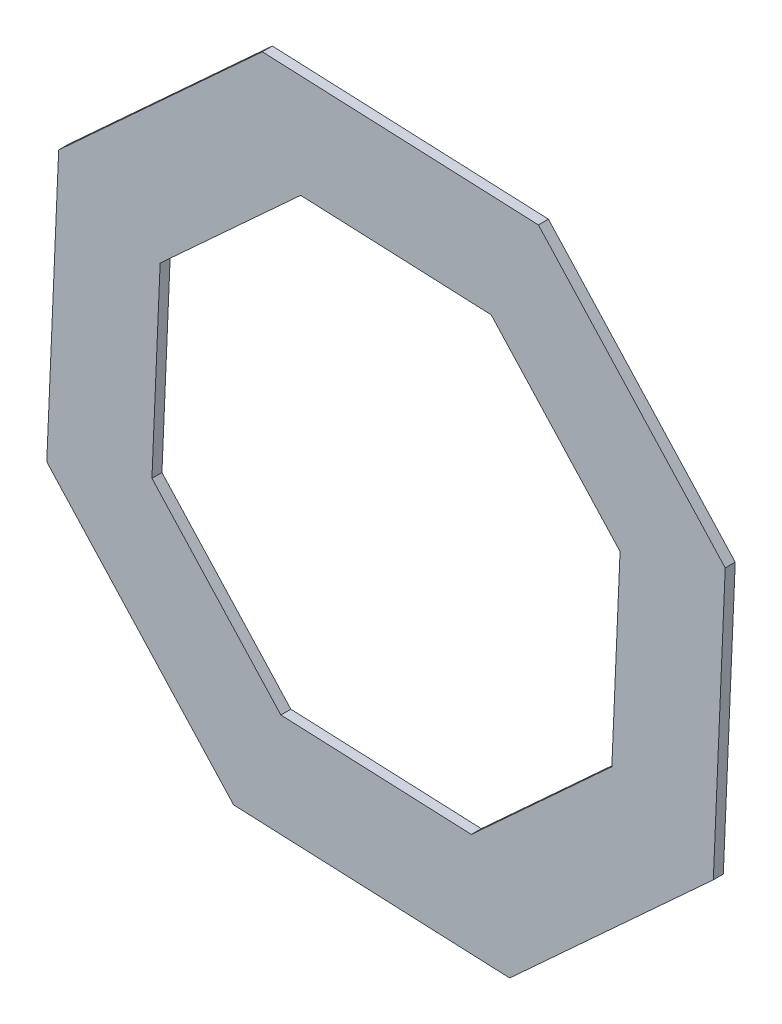
ISO-10303-21;
HEADER;
FILE_DESCRIPTION(('STEP AP214'),'2;1');
FILE_NAME('part.step','',(''),(''),'','','');
FILE_SCHEMA(('AUTOMOTIVE_DESIGN { 1 0 10303 214 1 1 1 1 }'));
ENDSEC;
DATA;
#1=APPLICATION_CONTEXT('core data for automotive mechanical design processes');
#2=APPLICATION_PROTOCOL_DEFINITION('international standard','automotive_design',2000,#1);
#3=PRODUCT_CONTEXT('',#1,'mechanical');
#4=PRODUCT('Part','Part','',(#3));
#5=PRODUCT_RELATED_PRODUCT_CATEGORY('part','',(#4));
#6=PRODUCT_DEFINITION_FORMATION('','',#4);
#7=PRODUCT_DEFINITION_CONTEXT('part definition',#1,'design');
#8=PRODUCT_DEFINITION('design','',#6,#7);
#9=PRODUCT_DEFINITION_SHAPE('','',#8);
#10=(LENGTH_UNIT() NAMED_UNIT(*) SI_UNIT(.MILLI.,.METRE.));
#11=(NAMED_UNIT(*) PLANE_ANGLE_UNIT() SI_UNIT($,.RADIAN.));
#12=(NAMED_UNIT(*) SI_UNIT($,.STERADIAN.) SOLID_ANGLE_UNIT());
#13=UNCERTAINTY_MEASURE_WITH_UNIT(LENGTH_MEASURE(1.E-05),#10,'distance_accuracy_value','');
#14=(GEOMETRIC_REPRESENTATION_CONTEXT(3) GLOBAL_UNCERTAINTY_ASSIGNED_CONTEXT((#13)) GLOBAL_UNIT_ASSIGNED_CONTEXT((#10,
#11,#12)) REPRESENTATION_CONTEXT('',''));
#15=CARTESIAN_POINT('',(0.,0.,0.));
#16=DIRECTION('',(0.,0.,1.));
#17=DIRECTION('',(1.,0.,0.));
#18=AXIS2_PLACEMENT_3D('',#15,#16,#17);
#19=CARTESIAN_POINT('',(45.692015403292,98.1222119650972,3.));
#20=DIRECTION('',(-0.0430913393774792,-0.999071136841944,0.));
#21=DIRECTION('',(0.999071136841944,-0.0430913393774792,0.));
#22=AXIS2_PLACEMENT_3D('',#19,#20,#21);
#23=PLANE('',#22);
#24=DIRECTION('',(-0.999071136841944,0.0430913393774792,0.));
#25=VECTOR('',#24,1.);
#26=CARTESIAN_POINT('',(45.692015403292,98.1222119650972,0.));
#27=LINE('',#26,#25);
#28=CARTESIAN_POINT('',(45.692015403292,98.1222119650972,0.));
#29=VERTEX_POINT('',#28);
#30=CARTESIAN_POINT('',(-37.0737475277961,101.692015403292,0.));
#31=VERTEX_POINT('',#30);
#32=EDGE_CURVE('E202',#29,#31,#27,.T.);
#33=ORIENTED_EDGE('',*,*,#32,.T.);
#34=DIRECTION('',(0.,0.,-1.));
#35=VECTOR('',#34,1.);
#36=CARTESIAN_POINT('',(-37.0737475277961,101.692015403292,3.));
#37=LINE('',#36,#35);
#38=CARTESIAN_POINT('',(-37.0737475277961,101.692015403292,3.));
#39=VERTEX_POINT('',#38);
#40=EDGE_CURVE('E11',#39,#31,#37,.T.);
#41=ORIENTED_EDGE('',*,*,#40,.F.);
#42=DIRECTION('',(-0.999071136841944,0.0430913393774792,0.));
#43=VECTOR('',#42,1.);
#44=CARTESIAN_POINT('',(45.692015403292,98.1222119650972,3.));
#45=LINE('',#44,#43);
#46=CARTESIAN_POINT('',(45.692015403292,98.1222119650972,3.));
#47=VERTEX_POINT('',#46);
#48=EDGE_CURVE('E214',#47,#39,#45,.T.);
#49=ORIENTED_EDGE('',*,*,#48,.F.);
#50=DIRECTION('',(0.,0.,-1.));
#51=VECTOR('',#50,1.);
#52=CARTESIAN_POINT('',(45.692015403292,98.1222119650972,3.));
#53=LINE('',#52,#51);
#54=EDGE_CURVE('E232',#47,#29,#53,.T.);
#55=ORIENTED_EDGE('',*,*,#54,.T.);
#56=EDGE_LOOP('',(#33,#41,#49,#55));
#57=FACE_BOUND('',#56,.T.);
#58=ADVANCED_FACE('F33',(#57),#23,.F.);
#59=CARTESIAN_POINT('',(-37.0737475277961,101.692015403292,3.));
#60=DIRECTION('',(0.675979797464465,-0.736920154032918,0.));
#61=DIRECTION('',(0.736920154032918,0.675979797464465,0.));
#62=AXIS2_PLACEMENT_3D('',#59,#60,#61);
#63=PLANE('',#62);
#64=DIRECTION('',(-0.736920154032918,-0.675979797464465,0.));
#65=VECTOR('',#64,1.);
#66=CARTESIAN_POINT('',(-37.0737475277961,101.692015403292,0.));
#67=LINE('',#66,#65);
#68=CARTESIAN_POINT('',(-98.1222119650972,45.692015403292,0.));
#69=VERTEX_POINT('',#68);
#70=EDGE_CURVE('E235',#31,#69,#67,.T.);
#71=ORIENTED_EDGE('',*,*,#70,.T.);
#72=DIRECTION('',(0.,0.,-1.));
#73=VECTOR('',#72,1.);
#74=CARTESIAN_POINT('',(-98.1222119650972,45.692015403292,3.));
#75=LINE('',#74,#73);
#76=CARTESIAN_POINT('',(-98.1222119650972,45.692015403292,3.));
#77=VERTEX_POINT('',#76);
#78=EDGE_CURVE('E40',#77,#69,#75,.T.);
#79=ORIENTED_EDGE('',*,*,#78,.F.);
#80=DIRECTION('',(-0.736920154032918,-0.675979797464465,0.));
#81=VECTOR('',#80,1.);
#82=CARTESIAN_POINT('',(-37.0737475277961,101.692015403292,3.));
#83=LINE('',#82,#81);
#84=EDGE_CURVE('E217',#39,#77,#83,.T.);
#85=ORIENTED_EDGE('',*,*,#84,.F.);
#86=ORIENTED_EDGE('',*,*,#40,.T.);
#87=EDGE_LOOP('',(#71,#79,#85,#86));
#88=FACE_BOUND('',#87,.T.);
#89=ADVANCED_FACE('F290',(#88),#63,.F.);
#90=CARTESIAN_POINT('',(-98.1222119650972,45.692015403292,3.));
#91=DIRECTION('',(0.999071136841944,-0.0430913393774798,0.));
#92=DIRECTION('',(0.0430913393774798,0.999071136841944,0.));
#93=AXIS2_PLACEMENT_3D('',#90,#91,#92);
#94=PLANE('',#93);
#95=DIRECTION('',(-0.0430913393774798,-0.999071136841944,0.));
#96=VECTOR('',#95,1.);
#97=CARTESIAN_POINT('',(-98.1222119650972,45.692015403292,0.));
#98=LINE('',#97,#96);
#99=CARTESIAN_POINT('',(-101.692015403292,-37.0737475277961,0.));
#100=VERTEX_POINT('',#99);
#101=EDGE_CURVE('E237',#69,#100,#98,.T.);
#102=ORIENTED_EDGE('',*,*,#101,.T.);
#103=DIRECTION('',(0.,0.,-1.));
#104=VECTOR('',#103,1.);
#105=CARTESIAN_POINT('',(-101.692015403292,-37.0737475277961,3.));
#106=LINE('',#105,#104);
#107=CARTESIAN_POINT('',(-101.692015403292,-37.0737475277961,3.));
#108=VERTEX_POINT('',#107);
#109=EDGE_CURVE('E262',#108,#100,#106,.T.);
#110=ORIENTED_EDGE('',*,*,#109,.F.);
#111=DIRECTION('',(-0.0430913393774798,-0.999071136841944,0.));
#112=VECTOR('',#111,1.);
#113=CARTESIAN_POINT('',(-98.1222119650972,45.692015403292,3.));
#114=LINE('',#113,#112);
#115=EDGE_CURVE('E220',#77,#108,#114,.T.);
#116=ORIENTED_EDGE('',*,*,#115,.F.);
#117=ORIENTED_EDGE('',*,*,#78,.T.);
#118=EDGE_LOOP('',(#102,#110,#116,#117));
#119=FACE_BOUND('',#118,.T.);
#120=ADVANCED_FACE('F269',(#119),#94,.F.);
#121=CARTESIAN_POINT('',(-101.692015403292,-37.0737475277961,3.));
#122=DIRECTION('',(0.736920154032918,0.675979797464465,0.));
#123=DIRECTION('',(-0.675979797464465,0.736920154032919,0.));
#124=AXIS2_PLACEMENT_3D('',#121,#122,#123);
#125=PLANE('',#124);
#126=DIRECTION('',(0.675979797464465,-0.736920154032918,0.));
#127=VECTOR('',#126,1.);
#128=CARTESIAN_POINT('',(-101.692015403292,-37.0737475277961,0.));
#129=LINE('',#128,#127);
#130=CARTESIAN_POINT('',(-45.692015403292,-98.1222119650972,0.));
#131=VERTEX_POINT('',#130);
#132=EDGE_CURVE('E239',#100,#131,#129,.T.);
#133=ORIENTED_EDGE('',*,*,#132,.T.);
#134=DIRECTION('',(0.,0.,-1.));
#135=VECTOR('',#134,1.);
#136=CARTESIAN_POINT('',(-45.692015403292,-98.1222119650972,3.));
#137=LINE('',#136,#135);
#138=CARTESIAN_POINT('',(-45.692015403292,-98.1222119650972,3.));
#139=VERTEX_POINT('',#138);
#140=EDGE_CURVE('E259',#139,#131,#137,.T.);
#141=ORIENTED_EDGE('',*,*,#140,.F.);
#142=DIRECTION('',(0.675979797464465,-0.736920154032918,0.));
#143=VECTOR('',#142,1.);
#144=CARTESIAN_POINT('',(-101.692015403292,-37.0737475277961,3.));
#145=LINE('',#144,#143);
#146=EDGE_CURVE('E222',#108,#139,#145,.T.);
#147=ORIENTED_EDGE('',*,*,#146,.F.);
#148=ORIENTED_EDGE('',*,*,#109,.T.);
#149=EDGE_LOOP('',(#133,#141,#147,#148));
#150=FACE_BOUND('',#149,.T.);
#151=ADVANCED_FACE('F280',(#150),#125,.F.);
#152=CARTESIAN_POINT('',(-45.692015403292,-98.1222119650972,3.));
#153=DIRECTION('',(0.0430913393774795,0.999071136841944,0.));
#154=DIRECTION('',(-0.999071136841944,0.0430913393774795,0.));
#155=AXIS2_PLACEMENT_3D('',#152,#153,#154);
#156=PLANE('',#155);
#157=DIRECTION('',(0.999071136841944,-0.0430913393774795,0.));
#158=VECTOR('',#157,1.);
#159=CARTESIAN_POINT('',(-45.692015403292,-98.1222119650972,0.));
#160=LINE('',#159,#158);
#161=CARTESIAN_POINT('',(37.0737475277961,-101.692015403292,0.));
#162=VERTEX_POINT('',#161);
#163=EDGE_CURVE('E241',#131,#162,#160,.T.);
#164=ORIENTED_EDGE('',*,*,#163,.T.);
#165=DIRECTION('',(0.,0.,-1.));
#166=VECTOR('',#165,1.);
#167=CARTESIAN_POINT('',(37.0737475277961,-101.692015403292,3.));
#168=LINE('',#167,#166);
#169=CARTESIAN_POINT('',(37.0737475277961,-101.692015403292,3.));
#170=VERTEX_POINT('',#169);
#171=EDGE_CURVE('E256',#170,#162,#168,.T.);
#172=ORIENTED_EDGE('',*,*,#171,.F.);
#173=DIRECTION('',(0.999071136841944,-0.0430913393774795,0.));
#174=VECTOR('',#173,1.);
#175=CARTESIAN_POINT('',(-45.692015403292,-98.1222119650972,3.));
#176=LINE('',#175,#174);
#177=EDGE_CURVE('E224',#139,#170,#176,.T.);
#178=ORIENTED_EDGE('',*,*,#177,.F.);
#179=ORIENTED_EDGE('',*,*,#140,.T.);
#180=EDGE_LOOP('',(#164,#172,#178,#179));
#181=FACE_BOUND('',#180,.T.);
#182=ADVANCED_FACE('F284',(#181),#156,.F.);
#183=CARTESIAN_POINT('',(37.0737475277961,-101.692015403292,3.));
#184=DIRECTION('',(-0.675979797464465,0.736920154032919,0.));
#185=DIRECTION('',(-0.736920154032919,-0.675979797464465,0.));
#186=AXIS2_PLACEMENT_3D('',#183,#184,#185);
#187=PLANE('',#186);
#188=DIRECTION('',(0.736920154032919,0.675979797464465,0.));
#189=VECTOR('',#188,1.);
#190=CARTESIAN_POINT('',(37.0737475277961,-101.692015403292,0.));
#191=LINE('',#190,#189);
#192=CARTESIAN_POINT('',(98.1222119650972,-45.692015403292,0.));
#193=VERTEX_POINT('',#192);
#194=EDGE_CURVE('E243',#162,#193,#191,.T.);
#195=ORIENTED_EDGE('',*,*,#194,.T.);
#196=DIRECTION('',(0.,0.,-1.));
#197=VECTOR('',#196,1.);
#198=CARTESIAN_POINT('',(98.1222119650972,-45.692015403292,3.));
#199=LINE('',#198,#197);
#200=CARTESIAN_POINT('',(98.1222119650972,-45.692015403292,3.));
#201=VERTEX_POINT('',#200);
#202=EDGE_CURVE('E253',#201,#193,#199,.T.);
#203=ORIENTED_EDGE('',*,*,#202,.F.);
#204=DIRECTION('',(0.736920154032919,0.675979797464465,0.));
#205=VECTOR('',#204,1.);
#206=CARTESIAN_POINT('',(37.0737475277961,-101.692015403292,3.));
#207=LINE('',#206,#205);
#208=EDGE_CURVE('E226',#170,#201,#207,.T.);
#209=ORIENTED_EDGE('',*,*,#208,.F.);
#210=ORIENTED_EDGE('',*,*,#171,.T.);
#211=EDGE_LOOP('',(#195,#203,#209,#210));
#212=FACE_BOUND('',#211,.T.);
#213=ADVANCED_FACE('F303',(#212),#187,.F.);
#214=CARTESIAN_POINT('',(98.1222119650972,-45.692015403292,3.));
#215=DIRECTION('',(-0.999071136841944,0.0430913393774792,0.));
#216=DIRECTION('',(-0.0430913393774792,-0.999071136841944,0.));
#217=AXIS2_PLACEMENT_3D('',#214,#215,#216);
#218=PLANE('',#217);
#219=DIRECTION('',(0.0430913393774792,0.999071136841944,0.));
#220=VECTOR('',#219,1.);
#221=CARTESIAN_POINT('',(98.1222119650972,-45.692015403292,0.));
#222=LINE('',#221,#220);
#223=CARTESIAN_POINT('',(101.692015403292,37.0737475277961,0.));
#224=VERTEX_POINT('',#223);
#225=EDGE_CURVE('E245',#193,#224,#222,.T.);
#226=ORIENTED_EDGE('',*,*,#225,.T.);
#227=DIRECTION('',(0.,0.,-1.));
#228=VECTOR('',#227,1.);
#229=CARTESIAN_POINT('',(101.692015403292,37.0737475277961,3.));
#230=LINE('',#229,#228);
#231=CARTESIAN_POINT('',(101.692015403292,37.0737475277961,3.));
#232=VERTEX_POINT('',#231);
#233=EDGE_CURVE('E250',#232,#224,#230,.T.);
#234=ORIENTED_EDGE('',*,*,#233,.F.);
#235=DIRECTION('',(0.0430913393774792,0.999071136841944,0.));
#236=VECTOR('',#235,1.);
#237=CARTESIAN_POINT('',(98.1222119650972,-45.692015403292,3.));
#238=LINE('',#237,#236);
#239=EDGE_CURVE('E228',#201,#232,#238,.T.);
#240=ORIENTED_EDGE('',*,*,#239,.F.);
#241=ORIENTED_EDGE('',*,*,#202,.T.);
#242=EDGE_LOOP('',(#226,#234,#240,#241));
#243=FACE_BOUND('',#242,.T.);
#244=ADVANCED_FACE('F301',(#243),#218,.F.);
#245=CARTESIAN_POINT('',(101.692015403292,37.0737475277961,3.));
#246=DIRECTION('',(-0.736920154032918,-0.675979797464465,0.));
#247=DIRECTION('',(0.675979797464465,-0.736920154032919,0.));
#248=AXIS2_PLACEMENT_3D('',#245,#246,#247);
#249=PLANE('',#248);
#250=DIRECTION('',(-0.675979797464465,0.736920154032919,0.));
#251=VECTOR('',#250,1.);
#252=CARTESIAN_POINT('',(101.692015403292,37.0737475277961,0.));
#253=LINE('',#252,#251);
#254=EDGE_CURVE('E218',#224,#29,#253,.T.);
#255=ORIENTED_EDGE('',*,*,#254,.T.);
#256=ORIENTED_EDGE('',*,*,#54,.F.);
#257=DIRECTION('',(-0.675979797464465,0.736920154032919,0.));
#258=VECTOR('',#257,1.);
#259=CARTESIAN_POINT('',(101.692015403292,37.0737475277961,3.));
#260=LINE('',#259,#258);
#261=EDGE_CURVE('E230',#232,#47,#260,.T.);
#262=ORIENTED_EDGE('',*,*,#261,.F.);
#263=ORIENTED_EDGE('',*,*,#233,.T.);
#264=EDGE_LOOP('',(#255,#256,#262,#263));
#265=FACE_BOUND('',#264,.T.);
#266=ADVANCED_FACE('F296',(#265),#249,.F.);
#267=CARTESIAN_POINT('',(0.,0.,3.));
#268=DIRECTION('',(0.,0.,1.));
#269=DIRECTION('',(1.,0.,0.));
#270=AXIS2_PLACEMENT_3D('',#267,#268,#269);
#271=PLANE('',#270);
#272=DIRECTION('',(-0.0430913393774868,-0.999071136841944,0.));
#273=VECTOR('',#272,1.);
#274=CARTESIAN_POINT('',(70.1674906282715,25.5808857941787,3.));
#275=LINE('',#274,#273);
#276=CARTESIAN_POINT('',(70.1674906282715,25.5808857941787,3.));
#277=VERTEX_POINT('',#276);
#278=CARTESIAN_POINT('',(67.7043262559167,-31.5274906282719,3.));
#279=VERTEX_POINT('',#278);
#280=EDGE_CURVE('E147',#277,#279,#275,.T.);
#281=ORIENTED_EDGE('',*,*,#280,.T.);
#282=DIRECTION('',(-0.736920154032924,-0.67597979746446,0.));
#283=VECTOR('',#282,1.);
#284=CARTESIAN_POINT('',(67.7043262559167,-31.5274906282719,3.));
#285=LINE('',#284,#283);
#286=CARTESIAN_POINT('',(25.5808857941787,-70.1674906282716,3.));
#287=VERTEX_POINT('',#286);
#288=EDGE_CURVE('E156',#279,#287,#285,.T.);
#289=ORIENTED_EDGE('',*,*,#288,.T.);
#290=DIRECTION('',(-0.999071136841944,0.043091339377487,0.));
#291=VECTOR('',#290,1.);
#292=CARTESIAN_POINT('',(25.5808857941787,-70.1674906282716,3.));
#293=LINE('',#292,#291);
#294=CARTESIAN_POINT('',(-31.5274906282719,-67.7043262559167,3.));
#295=VERTEX_POINT('',#294);
#296=EDGE_CURVE('E47',#287,#295,#293,.T.);
#297=ORIENTED_EDGE('',*,*,#296,.T.);
#298=DIRECTION('',(-0.67597979746446,0.736920154032923,0.));
#299=VECTOR('',#298,1.);
#300=CARTESIAN_POINT('',(-31.5274906282719,-67.7043262559167,3.));
#301=LINE('',#300,#299);
#302=CARTESIAN_POINT('',(-70.1674906282716,-25.5808857941787,3.));
#303=VERTEX_POINT('',#302);
#304=EDGE_CURVE('E171',#295,#303,#301,.T.);
#305=ORIENTED_EDGE('',*,*,#304,.T.);
#306=DIRECTION('',(0.043091339377487,0.999071136841944,0.));
#307=VECTOR('',#306,1.);
#308=CARTESIAN_POINT('',(-70.1674906282716,-25.5808857941787,3.));
#309=LINE('',#308,#307);
#310=CARTESIAN_POINT('',(-67.7043262559167,31.5274906282719,3.));
#311=VERTEX_POINT('',#310);
#312=EDGE_CURVE('E174',#303,#311,#309,.T.);
#313=ORIENTED_EDGE('',*,*,#312,.T.);
#314=DIRECTION('',(0.736920154032923,0.67597979746446,0.));
#315=VECTOR('',#314,1.);
#316=CARTESIAN_POINT('',(-67.7043262559167,31.5274906282719,3.));
#317=LINE('',#316,#315);
#318=CARTESIAN_POINT('',(-25.5808857941788,70.1674906282715,3.));
#319=VERTEX_POINT('',#318);
#320=EDGE_CURVE('E177',#311,#319,#317,.T.);
#321=ORIENTED_EDGE('',*,*,#320,.T.);
#322=DIRECTION('',(0.999071136841944,-0.0430913393774868,0.));
#323=VECTOR('',#322,1.);
#324=CARTESIAN_POINT('',(-25.5808857941788,70.1674906282715,3.));
#325=LINE('',#324,#323);
#326=CARTESIAN_POINT('',(31.5274906282719,67.7043262559167,3.));
#327=VERTEX_POINT('',#326);
#328=EDGE_CURVE('E180',#319,#327,#325,.T.);
#329=ORIENTED_EDGE('',*,*,#328,.T.);
#330=DIRECTION('',(0.67597979746446,-0.736920154032924,0.));
#331=VECTOR('',#330,1.);
#332=CARTESIAN_POINT('',(31.5274906282719,67.7043262559167,3.));
#333=LINE('',#332,#331);
#334=EDGE_CURVE('E153',#327,#277,#333,.T.);
#335=ORIENTED_EDGE('',*,*,#334,.T.);
#336=EDGE_LOOP('',(#281,#289,#297,#305,#313,#321,#329,#335));
#337=FACE_BOUND('',#336,.T.);
#338=ORIENTED_EDGE('',*,*,#48,.T.);
#339=ORIENTED_EDGE('',*,*,#84,.T.);
#340=ORIENTED_EDGE('',*,*,#115,.T.);
#341=ORIENTED_EDGE('',*,*,#146,.T.);
#342=ORIENTED_EDGE('',*,*,#177,.T.);
#343=ORIENTED_EDGE('',*,*,#208,.T.);
#344=ORIENTED_EDGE('',*,*,#239,.T.);
#345=ORIENTED_EDGE('',*,*,#261,.T.);
#346=EDGE_LOOP('',(#338,#339,#340,#341,#342,#343,#344,#345));
#347=FACE_BOUND('',#346,.T.);
#348=ADVANCED_FACE('F160',(#337,#347),#271,.T.);
#349=CARTESIAN_POINT('',(0.,0.,0.));
#350=DIRECTION('',(0.,0.,1.));
#351=DIRECTION('',(1.,0.,0.));
#352=AXIS2_PLACEMENT_3D('',#349,#350,#351);
#353=PLANE('',#352);
#354=DIRECTION('',(-0.736920154032924,-0.67597979746446,0.));
#355=VECTOR('',#354,1.);
#356=CARTESIAN_POINT('',(67.7043262559167,-31.5274906282719,0.));
#357=LINE('',#356,#355);
#358=CARTESIAN_POINT('',(67.7043262559167,-31.5274906282719,0.));
#359=VERTEX_POINT('',#358);
#360=CARTESIAN_POINT('',(25.5808857941787,-70.1674906282716,0.));
#361=VERTEX_POINT('',#360);
#362=EDGE_CURVE('E184',#359,#361,#357,.T.);
#363=ORIENTED_EDGE('',*,*,#362,.F.);
#364=DIRECTION('',(-0.0430913393774868,-0.999071136841944,0.));
#365=VECTOR('',#364,1.);
#366=CARTESIAN_POINT('',(70.1674906282715,25.5808857941787,0.));
#367=LINE('',#366,#365);
#368=CARTESIAN_POINT('',(70.1674906282715,25.5808857941787,0.));
#369=VERTEX_POINT('',#368);
#370=EDGE_CURVE('E55',#369,#359,#367,.T.);
#371=ORIENTED_EDGE('',*,*,#370,.F.);
#372=DIRECTION('',(0.67597979746446,-0.736920154032924,0.));
#373=VECTOR('',#372,1.);
#374=CARTESIAN_POINT('',(31.5274906282719,67.7043262559167,0.));
#375=LINE('',#374,#373);
#376=CARTESIAN_POINT('',(31.5274906282719,67.7043262559167,0.));
#377=VERTEX_POINT('',#376);
#378=EDGE_CURVE('E164',#377,#369,#375,.T.);
#379=ORIENTED_EDGE('',*,*,#378,.F.);
#380=DIRECTION('',(0.999071136841944,-0.0430913393774868,0.));
#381=VECTOR('',#380,1.);
#382=CARTESIAN_POINT('',(-25.5808857941788,70.1674906282715,0.));
#383=LINE('',#382,#381);
#384=CARTESIAN_POINT('',(-25.5808857941788,70.1674906282715,0.));
#385=VERTEX_POINT('',#384);
#386=EDGE_CURVE('E167',#385,#377,#383,.T.);
#387=ORIENTED_EDGE('',*,*,#386,.F.);
#388=DIRECTION('',(0.736920154032923,0.67597979746446,0.));
#389=VECTOR('',#388,1.);
#390=CARTESIAN_POINT('',(-67.7043262559167,31.5274906282719,0.));
#391=LINE('',#390,#389);
#392=CARTESIAN_POINT('',(-67.7043262559167,31.5274906282719,0.));
#393=VERTEX_POINT('',#392);
#394=EDGE_CURVE('E195',#393,#385,#391,.T.);
#395=ORIENTED_EDGE('',*,*,#394,.F.);
#396=DIRECTION('',(0.043091339377487,0.999071136841944,0.));
#397=VECTOR('',#396,1.);
#398=CARTESIAN_POINT('',(-70.1674906282716,-25.5808857941787,0.));
#399=LINE('',#398,#397);
#400=CARTESIAN_POINT('',(-70.1674906282716,-25.5808857941787,0.));
#401=VERTEX_POINT('',#400);
#402=EDGE_CURVE('E192',#401,#393,#399,.T.);
#403=ORIENTED_EDGE('',*,*,#402,.F.);
#404=DIRECTION('',(-0.67597979746446,0.736920154032923,0.));
#405=VECTOR('',#404,1.);
#406=CARTESIAN_POINT('',(-31.5274906282719,-67.7043262559167,0.));
#407=LINE('',#406,#405);
#408=CARTESIAN_POINT('',(-31.5274906282719,-67.7043262559167,0.));
#409=VERTEX_POINT('',#408);
#410=EDGE_CURVE('E189',#409,#401,#407,.T.);
#411=ORIENTED_EDGE('',*,*,#410,.F.);
#412=DIRECTION('',(-0.999071136841944,0.043091339377487,0.));
#413=VECTOR('',#412,1.);
#414=CARTESIAN_POINT('',(25.5808857941787,-70.1674906282716,0.));
#415=LINE('',#414,#413);
#416=EDGE_CURVE('E186',#361,#409,#415,.T.);
#417=ORIENTED_EDGE('',*,*,#416,.F.);
#418=EDGE_LOOP('',(#363,#371,#379,#387,#395,#403,#411,#417));
#419=FACE_BOUND('',#418,.T.);
#420=ORIENTED_EDGE('',*,*,#32,.F.);
#421=ORIENTED_EDGE('',*,*,#254,.F.);
#422=ORIENTED_EDGE('',*,*,#225,.F.);
#423=ORIENTED_EDGE('',*,*,#194,.F.);
#424=ORIENTED_EDGE('',*,*,#163,.F.);
#425=ORIENTED_EDGE('',*,*,#132,.F.);
#426=ORIENTED_EDGE('',*,*,#101,.F.);
#427=ORIENTED_EDGE('',*,*,#70,.F.);
#428=EDGE_LOOP('',(#420,#421,#422,#423,#424,#425,#426,#427));
#429=FACE_BOUND('',#428,.T.);
#430=ADVANCED_FACE('F275',(#419,#429),#353,.F.);
#431=CARTESIAN_POINT('',(70.1674906282715,25.5808857941787,3.));
#432=DIRECTION('',(0.999071136841944,-0.0430913393774868,0.));
#433=DIRECTION('',(0.0430913393774868,0.999071136841944,0.));
#434=AXIS2_PLACEMENT_3D('',#431,#432,#433);
#435=PLANE('',#434);
#436=ORIENTED_EDGE('',*,*,#370,.T.);
#437=DIRECTION('',(0.,0.,-1.));
#438=VECTOR('',#437,1.);
#439=CARTESIAN_POINT('',(67.7043262559167,-31.5274906282719,3.));
#440=LINE('',#439,#438);
#441=EDGE_CURVE('E143',#279,#359,#440,.T.);
#442=ORIENTED_EDGE('',*,*,#441,.F.);
#443=ORIENTED_EDGE('',*,*,#280,.F.);
#444=DIRECTION('',(0.,0.,-1.));
#445=VECTOR('',#444,1.);
#446=CARTESIAN_POINT('',(70.1674906282715,25.5808857941787,3.));
#447=LINE('',#446,#445);
#448=EDGE_CURVE('E200',#277,#369,#447,.T.);
#449=ORIENTED_EDGE('',*,*,#448,.T.);
#450=EDGE_LOOP('',(#436,#442,#443,#449));
#451=FACE_BOUND('',#450,.T.);
#452=ADVANCED_FACE('F145',(#451),#435,.F.);
#453=CARTESIAN_POINT('',(31.5274906282719,67.7043262559167,3.));
#454=DIRECTION('',(0.736920154032924,0.67597979746446,0.));
#455=DIRECTION('',(-0.67597979746446,0.736920154032924,0.));
#456=AXIS2_PLACEMENT_3D('',#453,#454,#455);
#457=PLANE('',#456);
#458=ORIENTED_EDGE('',*,*,#378,.T.);
#459=ORIENTED_EDGE('',*,*,#448,.F.);
#460=ORIENTED_EDGE('',*,*,#334,.F.);
#461=DIRECTION('',(0.,0.,-1.));
#462=VECTOR('',#461,1.);
#463=CARTESIAN_POINT('',(31.5274906282719,67.7043262559167,3.));
#464=LINE('',#463,#462);
#465=EDGE_CURVE('E203',#327,#377,#464,.T.);
#466=ORIENTED_EDGE('',*,*,#465,.T.);
#467=EDGE_LOOP('',(#458,#459,#460,#466));
#468=FACE_BOUND('',#467,.T.);
#469=ADVANCED_FACE('F374',(#468),#457,.F.);
#470=CARTESIAN_POINT('',(-25.5808857941788,70.1674906282715,3.));
#471=DIRECTION('',(0.0430913393774868,0.999071136841944,0.));
#472=DIRECTION('',(-0.999071136841944,0.0430913393774868,0.));
#473=AXIS2_PLACEMENT_3D('',#470,#471,#472);
#474=PLANE('',#473);
#475=ORIENTED_EDGE('',*,*,#386,.T.);
#476=ORIENTED_EDGE('',*,*,#465,.F.);
#477=ORIENTED_EDGE('',*,*,#328,.F.);
#478=DIRECTION('',(0.,0.,-1.));
#479=VECTOR('',#478,1.);
#480=CARTESIAN_POINT('',(-25.5808857941788,70.1674906282715,3.));
#481=LINE('',#480,#479);
#482=EDGE_CURVE('E205',#319,#385,#481,.T.);
#483=ORIENTED_EDGE('',*,*,#482,.T.);
#484=EDGE_LOOP('',(#475,#476,#477,#483));
#485=FACE_BOUND('',#484,.T.);
#486=ADVANCED_FACE('F383',(#485),#474,.F.);
#487=CARTESIAN_POINT('',(-67.7043262559167,31.5274906282719,3.));
#488=DIRECTION('',(-0.67597979746446,0.736920154032923,0.));
#489=DIRECTION('',(-0.736920154032923,-0.67597979746446,0.));
#490=AXIS2_PLACEMENT_3D('',#487,#488,#489);
#491=PLANE('',#490);
#492=ORIENTED_EDGE('',*,*,#394,.T.);
#493=ORIENTED_EDGE('',*,*,#482,.F.);
#494=ORIENTED_EDGE('',*,*,#320,.F.);
#495=DIRECTION('',(0.,0.,-1.));
#496=VECTOR('',#495,1.);
#497=CARTESIAN_POINT('',(-67.7043262559167,31.5274906282719,3.));
#498=LINE('',#497,#496);
#499=EDGE_CURVE('E207',#311,#393,#498,.T.);
#500=ORIENTED_EDGE('',*,*,#499,.T.);
#501=EDGE_LOOP('',(#492,#493,#494,#500));
#502=FACE_BOUND('',#501,.T.);
#503=ADVANCED_FACE('F393',(#502),#491,.F.);
#504=CARTESIAN_POINT('',(-70.1674906282716,-25.5808857941787,3.));
#505=DIRECTION('',(-0.999071136841944,0.043091339377487,0.));
#506=DIRECTION('',(-0.043091339377487,-0.999071136841944,0.));
#507=AXIS2_PLACEMENT_3D('',#504,#505,#506);
#508=PLANE('',#507);
#509=ORIENTED_EDGE('',*,*,#402,.T.);
#510=ORIENTED_EDGE('',*,*,#499,.F.);
#511=ORIENTED_EDGE('',*,*,#312,.F.);
#512=DIRECTION('',(0.,0.,-1.));
#513=VECTOR('',#512,1.);
#514=CARTESIAN_POINT('',(-70.1674906282716,-25.5808857941787,3.));
#515=LINE('',#514,#513);
#516=EDGE_CURVE('E209',#303,#401,#515,.T.);
#517=ORIENTED_EDGE('',*,*,#516,.T.);
#518=EDGE_LOOP('',(#509,#510,#511,#517));
#519=FACE_BOUND('',#518,.T.);
#520=ADVANCED_FACE('F403',(#519),#508,.F.);
#521=CARTESIAN_POINT('',(-31.5274906282719,-67.7043262559167,3.));
#522=DIRECTION('',(-0.736920154032924,-0.67597979746446,0.));
#523=DIRECTION('',(0.67597979746446,-0.736920154032924,0.));
#524=AXIS2_PLACEMENT_3D('',#521,#522,#523);
#525=PLANE('',#524);
#526=ORIENTED_EDGE('',*,*,#410,.T.);
#527=ORIENTED_EDGE('',*,*,#516,.F.);
#528=ORIENTED_EDGE('',*,*,#304,.F.);
#529=DIRECTION('',(0.,0.,-1.));
#530=VECTOR('',#529,1.);
#531=CARTESIAN_POINT('',(-31.5274906282719,-67.7043262559167,3.));
#532=LINE('',#531,#530);
#533=EDGE_CURVE('E211',#295,#409,#532,.T.);
#534=ORIENTED_EDGE('',*,*,#533,.T.);
#535=EDGE_LOOP('',(#526,#527,#528,#534));
#536=FACE_BOUND('',#535,.T.);
#537=ADVANCED_FACE('F413',(#536),#525,.F.);
#538=CARTESIAN_POINT('',(25.5808857941787,-70.1674906282716,3.));
#539=DIRECTION('',(-0.043091339377487,-0.999071136841944,0.));
#540=DIRECTION('',(0.999071136841944,-0.043091339377487,0.));
#541=AXIS2_PLACEMENT_3D('',#538,#539,#540);
#542=PLANE('',#541);
#543=ORIENTED_EDGE('',*,*,#416,.T.);
#544=ORIENTED_EDGE('',*,*,#533,.F.);
#545=ORIENTED_EDGE('',*,*,#296,.F.);
#546=DIRECTION('',(0.,0.,-1.));
#547=VECTOR('',#546,1.);
#548=CARTESIAN_POINT('',(25.5808857941787,-70.1674906282716,3.));
#549=LINE('',#548,#547);
#550=EDGE_CURVE('E152',#287,#361,#549,.T.);
#551=ORIENTED_EDGE('',*,*,#550,.T.);
#552=EDGE_LOOP('',(#543,#544,#545,#551));
#553=FACE_BOUND('',#552,.T.);
#554=ADVANCED_FACE('F423',(#553),#542,.F.);
#555=CARTESIAN_POINT('',(67.7043262559167,-31.5274906282719,3.));
#556=DIRECTION('',(0.67597979746446,-0.736920154032924,0.));
#557=DIRECTION('',(0.736920154032924,0.67597979746446,0.));
#558=AXIS2_PLACEMENT_3D('',#555,#556,#557);
#559=PLANE('',#558);
#560=ORIENTED_EDGE('',*,*,#362,.T.);
#561=ORIENTED_EDGE('',*,*,#550,.F.);
#562=ORIENTED_EDGE('',*,*,#288,.F.);
#563=ORIENTED_EDGE('',*,*,#441,.T.);
#564=EDGE_LOOP('',(#560,#561,#562,#563));
#565=FACE_BOUND('',#564,.T.);
#566=ADVANCED_FACE('F157',(#565),#559,.F.);
#567=CLOSED_SHELL('',(#58,#89,#120,#151,#182,#213,#244,#266,#348,#430,#452,#469,#486,#503,#520,
#537,#554,#566));
#568=MANIFOLD_SOLID_BREP('B2',#567);
#569=ADVANCED_BREP_SHAPE_REPRESENTATION('',(#18,#568),#14);
#570=SHAPE_DEFINITION_REPRESENTATION(#9,#569);
ENDSEC;
END-ISO-10303-21;
